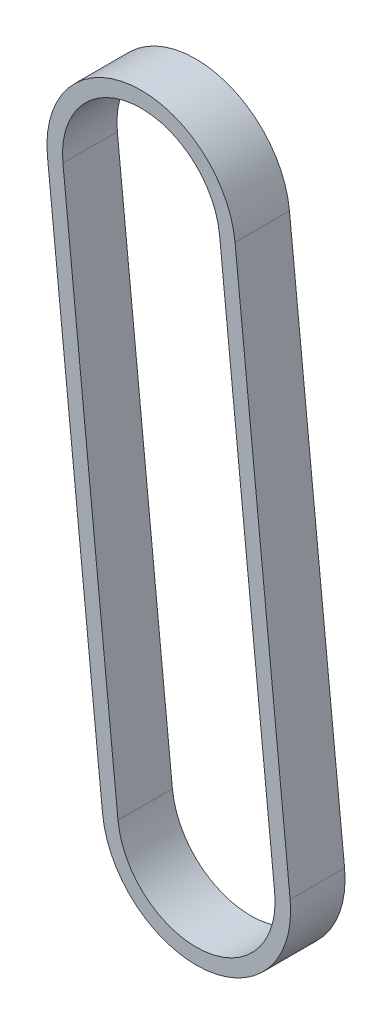
ISO-10303-21;
HEADER;
FILE_DESCRIPTION(('STEP AP214'),'2;1');
FILE_NAME('part.step','',(''),(''),'','','');
FILE_SCHEMA(('AUTOMOTIVE_DESIGN { 1 0 10303 214 1 1 1 1 }'));
ENDSEC;
DATA;
#1=APPLICATION_CONTEXT('core data for automotive mechanical design processes');
#2=APPLICATION_PROTOCOL_DEFINITION('international standard','automotive_design',2000,#1);
#3=PRODUCT_CONTEXT('',#1,'mechanical');
#4=PRODUCT('Part','Part','',(#3));
#5=PRODUCT_RELATED_PRODUCT_CATEGORY('part','',(#4));
#6=PRODUCT_DEFINITION_FORMATION('','',#4);
#7=PRODUCT_DEFINITION_CONTEXT('part definition',#1,'design');
#8=PRODUCT_DEFINITION('design','',#6,#7);
#9=PRODUCT_DEFINITION_SHAPE('','',#8);
#10=(LENGTH_UNIT() NAMED_UNIT(*) SI_UNIT(.MILLI.,.METRE.));
#11=(NAMED_UNIT(*) PLANE_ANGLE_UNIT() SI_UNIT($,.RADIAN.));
#12=(NAMED_UNIT(*) SI_UNIT($,.STERADIAN.) SOLID_ANGLE_UNIT());
#13=UNCERTAINTY_MEASURE_WITH_UNIT(LENGTH_MEASURE(1.E-05),#10,'distance_accuracy_value','');
#14=(GEOMETRIC_REPRESENTATION_CONTEXT(3) GLOBAL_UNCERTAINTY_ASSIGNED_CONTEXT((#13)) GLOBAL_UNIT_ASSIGNED_CONTEXT((#10,
#11,#12)) REPRESENTATION_CONTEXT('',''));
#15=CARTESIAN_POINT('',(0.,0.,0.));
#16=DIRECTION('',(0.,0.,1.));
#17=DIRECTION('',(1.,0.,0.));
#18=AXIS2_PLACEMENT_3D('',#15,#16,#17);
#19=CARTESIAN_POINT('',(-22.666284479526,-39.1802345315065,3.5));
#20=DIRECTION('',(0.,0.,-1.));
#21=DIRECTION('',(-1.,0.,0.));
#22=AXIS2_PLACEMENT_3D('',#19,#20,#21);
#23=PLANE('',#22);
#24=CARTESIAN_POINT('',(-22.666284479526,-39.1802345315065,3.5));
#25=DIRECTION('',(0.,0.,-1.));
#26=DIRECTION('',(-1.,0.,0.));
#27=AXIS2_PLACEMENT_3D('',#24,#25,#26);
#28=CIRCLE('',#27,12.125);
#29=CARTESIAN_POINT('',(-34.7290651312273,-40.4069977315341,3.5));
#30=VERTEX_POINT('',#29);
#31=CARTESIAN_POINT('',(-10.6035038278247,-37.953471331479,3.5));
#32=VERTEX_POINT('',#31);
#33=EDGE_CURVE('E160',#30,#32,#28,.F.);
#34=ORIENTED_EDGE('',*,*,#33,.T.);
#35=DIRECTION('',(-0.101176346394023,0.994868507356805,0.));
#36=VECTOR('',#35,1.);
#37=CARTESIAN_POINT('',(-10.6035038278248,-37.953471331479,3.5));
#38=LINE('',#37,#36);
#39=CARTESIAN_POINT('',(-17.6858480754069,31.6873241835021,3.5));
#40=VERTEX_POINT('',#39);
#41=EDGE_CURVE('E163',#32,#40,#38,.T.);
#42=ORIENTED_EDGE('',*,*,#41,.T.);
#43=CARTESIAN_POINT('',(-29.7486287271081,30.4605609834746,3.5));
#44=DIRECTION('',(0.,0.,-1.));
#45=DIRECTION('',(-1.,0.,0.));
#46=AXIS2_PLACEMENT_3D('',#43,#44,#45);
#47=CIRCLE('',#46,12.125);
#48=CARTESIAN_POINT('',(-41.8114093788094,29.233797783447,3.5));
#49=VERTEX_POINT('',#48);
#50=EDGE_CURVE('E166',#40,#49,#47,.F.);
#51=ORIENTED_EDGE('',*,*,#50,.T.);
#52=DIRECTION('',(0.101176346394023,-0.994868507356805,0.));
#53=VECTOR('',#52,1.);
#54=CARTESIAN_POINT('',(-34.7290651312273,-40.4069977315341,3.5));
#55=LINE('',#54,#53);
#56=EDGE_CURVE('E168',#49,#30,#55,.T.);
#57=ORIENTED_EDGE('',*,*,#56,.T.);
#58=EDGE_LOOP('',(#34,#42,#51,#57));
#59=FACE_BOUND('',#58,.T.);
#60=CARTESIAN_POINT('',(-22.666284479526,-39.1802345315065,3.5));
#61=DIRECTION('',(0.,0.,1.));
#62=DIRECTION('',(-1.,0.,0.));
#63=AXIS2_PLACEMENT_3D('',#60,#61,#62);
#64=CIRCLE('',#63,10.125);
#65=CARTESIAN_POINT('',(-32.7393281165137,-40.204645038746,3.5));
#66=VERTEX_POINT('',#65);
#67=CARTESIAN_POINT('',(-12.5932408425384,-38.1558240242671,3.5));
#68=VERTEX_POINT('',#67);
#69=EDGE_CURVE('E124',#66,#68,#64,.T.);
#70=ORIENTED_EDGE('',*,*,#69,.F.);
#71=DIRECTION('',(0.101176346394023,-0.994868507356805,0.));
#72=VECTOR('',#71,1.);
#73=CARTESIAN_POINT('',(-32.7393281165137,-40.204645038746,3.5));
#74=LINE('',#73,#72);
#75=CARTESIAN_POINT('',(-39.8216723640958,29.4361504762351,3.5));
#76=VERTEX_POINT('',#75);
#77=EDGE_CURVE('E146',#76,#66,#74,.T.);
#78=ORIENTED_EDGE('',*,*,#77,.F.);
#79=CARTESIAN_POINT('',(-29.7486287271081,30.4605609834746,3.5));
#80=DIRECTION('',(0.,0.,1.));
#81=DIRECTION('',(-1.,0.,0.));
#82=AXIS2_PLACEMENT_3D('',#79,#80,#81);
#83=CIRCLE('',#82,10.125);
#84=CARTESIAN_POINT('',(-19.6755850901205,31.484971490714,3.5));
#85=VERTEX_POINT('',#84);
#86=EDGE_CURVE('E144',#85,#76,#83,.T.);
#87=ORIENTED_EDGE('',*,*,#86,.F.);
#88=DIRECTION('',(-0.101176346394023,0.994868507356805,0.));
#89=VECTOR('',#88,1.);
#90=CARTESIAN_POINT('',(-19.6755850901205,31.484971490714,3.5));
#91=LINE('',#90,#89);
#92=EDGE_CURVE('E132',#68,#85,#91,.T.);
#93=ORIENTED_EDGE('',*,*,#92,.F.);
#94=EDGE_LOOP('',(#70,#78,#87,#93));
#95=FACE_BOUND('',#94,.T.);
#96=ADVANCED_FACE('F59',(#59,#95),#23,.F.);
#97=CARTESIAN_POINT('',(-22.666284479526,-39.1802345315065,-3.5));
#98=DIRECTION('',(0.,0.,-1.));
#99=DIRECTION('',(-1.,0.,0.));
#100=AXIS2_PLACEMENT_3D('',#97,#98,#99);
#101=PLANE('',#100);
#102=CARTESIAN_POINT('',(-22.666284479526,-39.1802345315065,-3.5));
#103=DIRECTION('',(0.,0.,-1.));
#104=DIRECTION('',(-1.,0.,0.));
#105=AXIS2_PLACEMENT_3D('',#102,#103,#104);
#106=CIRCLE('',#105,12.125);
#107=CARTESIAN_POINT('',(-34.7290651312273,-40.4069977315341,-3.5));
#108=VERTEX_POINT('',#107);
#109=CARTESIAN_POINT('',(-10.6035038278247,-37.953471331479,-3.5));
#110=VERTEX_POINT('',#109);
#111=EDGE_CURVE('E140',#108,#110,#106,.F.);
#112=ORIENTED_EDGE('',*,*,#111,.F.);
#113=DIRECTION('',(0.101176346394023,-0.994868507356805,0.));
#114=VECTOR('',#113,1.);
#115=CARTESIAN_POINT('',(-34.7290651312273,-40.4069977315341,-3.5));
#116=LINE('',#115,#114);
#117=CARTESIAN_POINT('',(-41.8114093788094,29.233797783447,-3.5));
#118=VERTEX_POINT('',#117);
#119=EDGE_CURVE('E164',#118,#108,#116,.T.);
#120=ORIENTED_EDGE('',*,*,#119,.F.);
#121=CARTESIAN_POINT('',(-29.7486287271081,30.4605609834746,-3.5));
#122=DIRECTION('',(0.,0.,-1.));
#123=DIRECTION('',(-1.,0.,0.));
#124=AXIS2_PLACEMENT_3D('',#121,#122,#123);
#125=CIRCLE('',#124,12.125);
#126=CARTESIAN_POINT('',(-17.6858480754069,31.6873241835021,-3.5));
#127=VERTEX_POINT('',#126);
#128=EDGE_CURVE('E175',#127,#118,#125,.F.);
#129=ORIENTED_EDGE('',*,*,#128,.F.);
#130=DIRECTION('',(-0.101176346394023,0.994868507356805,0.));
#131=VECTOR('',#130,1.);
#132=CARTESIAN_POINT('',(-10.6035038278248,-37.953471331479,-3.5));
#133=LINE('',#132,#131);
#134=EDGE_CURVE('E173',#110,#127,#133,.T.);
#135=ORIENTED_EDGE('',*,*,#134,.F.);
#136=EDGE_LOOP('',(#112,#120,#129,#135));
#137=FACE_BOUND('',#136,.T.);
#138=DIRECTION('',(0.101176346394023,-0.994868507356805,0.));
#139=VECTOR('',#138,1.);
#140=CARTESIAN_POINT('',(-32.7393281165137,-40.204645038746,-3.5));
#141=LINE('',#140,#139);
#142=CARTESIAN_POINT('',(-39.8216723640958,29.4361504762351,-3.5));
#143=VERTEX_POINT('',#142);
#144=CARTESIAN_POINT('',(-32.7393281165137,-40.204645038746,-3.5));
#145=VERTEX_POINT('',#144);
#146=EDGE_CURVE('E133',#143,#145,#141,.T.);
#147=ORIENTED_EDGE('',*,*,#146,.T.);
#148=CARTESIAN_POINT('',(-22.666284479526,-39.1802345315065,-3.5));
#149=DIRECTION('',(0.,0.,1.));
#150=DIRECTION('',(-1.,0.,0.));
#151=AXIS2_PLACEMENT_3D('',#148,#149,#150);
#152=CIRCLE('',#151,10.125);
#153=CARTESIAN_POINT('',(-12.5932408425384,-38.1558240242671,-3.5));
#154=VERTEX_POINT('',#153);
#155=EDGE_CURVE('E82',#145,#154,#152,.T.);
#156=ORIENTED_EDGE('',*,*,#155,.T.);
#157=DIRECTION('',(-0.101176346394023,0.994868507356805,0.));
#158=VECTOR('',#157,1.);
#159=CARTESIAN_POINT('',(-19.6755850901205,31.484971490714,-3.5));
#160=LINE('',#159,#158);
#161=CARTESIAN_POINT('',(-19.6755850901205,31.484971490714,-3.5));
#162=VERTEX_POINT('',#161);
#163=EDGE_CURVE('E139',#154,#162,#160,.T.);
#164=ORIENTED_EDGE('',*,*,#163,.T.);
#165=CARTESIAN_POINT('',(-29.7486287271081,30.4605609834746,-3.5));
#166=DIRECTION('',(0.,0.,1.));
#167=DIRECTION('',(-1.,0.,0.));
#168=AXIS2_PLACEMENT_3D('',#165,#166,#167);
#169=CIRCLE('',#168,10.125);
#170=EDGE_CURVE('E152',#162,#143,#169,.T.);
#171=ORIENTED_EDGE('',*,*,#170,.T.);
#172=EDGE_LOOP('',(#147,#156,#164,#171));
#173=FACE_BOUND('',#172,.T.);
#174=ADVANCED_FACE('F193',(#137,#173),#101,.T.);
#175=CARTESIAN_POINT('',(-22.666284479526,-39.1802345315065,3.5));
#176=DIRECTION('',(0.,0.,-1.));
#177=DIRECTION('',(-1.,0.,0.));
#178=AXIS2_PLACEMENT_3D('',#175,#176,#177);
#179=CYLINDRICAL_SURFACE('',#178,12.125);
#180=ORIENTED_EDGE('',*,*,#111,.T.);
#181=DIRECTION('',(0.,0.,-1.));
#182=VECTOR('',#181,1.);
#183=CARTESIAN_POINT('',(-10.6035038278247,-37.953471331479,3.5));
#184=LINE('',#183,#182);
#185=EDGE_CURVE('E12',#32,#110,#184,.T.);
#186=ORIENTED_EDGE('',*,*,#185,.F.);
#187=ORIENTED_EDGE('',*,*,#33,.F.);
#188=DIRECTION('',(0.,0.,-1.));
#189=VECTOR('',#188,1.);
#190=CARTESIAN_POINT('',(-34.7290651312273,-40.4069977315341,3.5));
#191=LINE('',#190,#189);
#192=EDGE_CURVE('E170',#30,#108,#191,.T.);
#193=ORIENTED_EDGE('',*,*,#192,.T.);
#194=EDGE_LOOP('',(#180,#186,#187,#193));
#195=FACE_BOUND('',#194,.T.);
#196=ADVANCED_FACE('F61',(#195),#179,.T.);
#197=CARTESIAN_POINT('',(-10.6035038278248,-37.953471331479,3.5));
#198=DIRECTION('',(-0.994868507356805,-0.101176346394023,0.));
#199=DIRECTION('',(0.101176346394023,-0.994868507356805,0.));
#200=AXIS2_PLACEMENT_3D('',#197,#198,#199);
#201=PLANE('',#200);
#202=ORIENTED_EDGE('',*,*,#134,.T.);
#203=DIRECTION('',(0.,0.,-1.));
#204=VECTOR('',#203,1.);
#205=CARTESIAN_POINT('',(-17.6858480754069,31.6873241835021,3.5));
#206=LINE('',#205,#204);
#207=EDGE_CURVE('E67',#40,#127,#206,.T.);
#208=ORIENTED_EDGE('',*,*,#207,.F.);
#209=ORIENTED_EDGE('',*,*,#41,.F.);
#210=ORIENTED_EDGE('',*,*,#185,.T.);
#211=EDGE_LOOP('',(#202,#208,#209,#210));
#212=FACE_BOUND('',#211,.T.);
#213=ADVANCED_FACE('F203',(#212),#201,.F.);
#214=CARTESIAN_POINT('',(-29.7486287271081,30.4605609834746,3.5));
#215=DIRECTION('',(0.,0.,-1.));
#216=DIRECTION('',(-1.,0.,0.));
#217=AXIS2_PLACEMENT_3D('',#214,#215,#216);
#218=CYLINDRICAL_SURFACE('',#217,12.125);
#219=ORIENTED_EDGE('',*,*,#128,.T.);
#220=DIRECTION('',(0.,0.,-1.));
#221=VECTOR('',#220,1.);
#222=CARTESIAN_POINT('',(-41.8114093788094,29.233797783447,3.5));
#223=LINE('',#222,#221);
#224=EDGE_CURVE('E180',#49,#118,#223,.T.);
#225=ORIENTED_EDGE('',*,*,#224,.F.);
#226=ORIENTED_EDGE('',*,*,#50,.F.);
#227=ORIENTED_EDGE('',*,*,#207,.T.);
#228=EDGE_LOOP('',(#219,#225,#226,#227));
#229=FACE_BOUND('',#228,.T.);
#230=ADVANCED_FACE('F187',(#229),#218,.T.);
#231=CARTESIAN_POINT('',(-34.7290651312273,-40.4069977315341,3.5));
#232=DIRECTION('',(0.994868507356805,0.101176346394023,0.));
#233=DIRECTION('',(-0.101176346394023,0.994868507356805,0.));
#234=AXIS2_PLACEMENT_3D('',#231,#232,#233);
#235=PLANE('',#234);
#236=ORIENTED_EDGE('',*,*,#119,.T.);
#237=ORIENTED_EDGE('',*,*,#192,.F.);
#238=ORIENTED_EDGE('',*,*,#56,.F.);
#239=ORIENTED_EDGE('',*,*,#224,.T.);
#240=EDGE_LOOP('',(#236,#237,#238,#239));
#241=FACE_BOUND('',#240,.T.);
#242=ADVANCED_FACE('F197',(#241),#235,.F.);
#243=CARTESIAN_POINT('',(-22.666284479526,-39.1802345315065,3.5));
#244=DIRECTION('',(0.,0.,-1.));
#245=DIRECTION('',(-1.,0.,0.));
#246=AXIS2_PLACEMENT_3D('',#243,#244,#245);
#247=CYLINDRICAL_SURFACE('',#246,10.125);
#248=ORIENTED_EDGE('',*,*,#155,.F.);
#249=DIRECTION('',(0.,0.,-1.));
#250=VECTOR('',#249,1.);
#251=CARTESIAN_POINT('',(-32.7393281165137,-40.204645038746,3.5));
#252=LINE('',#251,#250);
#253=EDGE_CURVE('E128',#66,#145,#252,.T.);
#254=ORIENTED_EDGE('',*,*,#253,.F.);
#255=ORIENTED_EDGE('',*,*,#69,.T.);
#256=DIRECTION('',(0.,0.,-1.));
#257=VECTOR('',#256,1.);
#258=CARTESIAN_POINT('',(-12.5932408425384,-38.1558240242671,3.5));
#259=LINE('',#258,#257);
#260=EDGE_CURVE('E127',#68,#154,#259,.T.);
#261=ORIENTED_EDGE('',*,*,#260,.T.);
#262=EDGE_LOOP('',(#248,#254,#255,#261));
#263=FACE_BOUND('',#262,.T.);
#264=ADVANCED_FACE('F126',(#263),#247,.F.);
#265=CARTESIAN_POINT('',(-19.6755850901205,31.484971490714,3.5));
#266=DIRECTION('',(-0.994868507356805,-0.101176346394023,0.));
#267=DIRECTION('',(0.101176346394023,-0.994868507356805,0.));
#268=AXIS2_PLACEMENT_3D('',#265,#266,#267);
#269=PLANE('',#268);
#270=ORIENTED_EDGE('',*,*,#163,.F.);
#271=ORIENTED_EDGE('',*,*,#260,.F.);
#272=ORIENTED_EDGE('',*,*,#92,.T.);
#273=DIRECTION('',(0.,0.,-1.));
#274=VECTOR('',#273,1.);
#275=CARTESIAN_POINT('',(-19.6755850901205,31.484971490714,3.5));
#276=LINE('',#275,#274);
#277=EDGE_CURVE('E141',#85,#162,#276,.T.);
#278=ORIENTED_EDGE('',*,*,#277,.T.);
#279=EDGE_LOOP('',(#270,#271,#272,#278));
#280=FACE_BOUND('',#279,.T.);
#281=ADVANCED_FACE('F136',(#280),#269,.T.);
#282=CARTESIAN_POINT('',(-29.7486287271081,30.4605609834746,3.5));
#283=DIRECTION('',(0.,0.,-1.));
#284=DIRECTION('',(-1.,0.,0.));
#285=AXIS2_PLACEMENT_3D('',#282,#283,#284);
#286=CYLINDRICAL_SURFACE('',#285,10.125);
#287=ORIENTED_EDGE('',*,*,#170,.F.);
#288=ORIENTED_EDGE('',*,*,#277,.F.);
#289=ORIENTED_EDGE('',*,*,#86,.T.);
#290=DIRECTION('',(0.,0.,-1.));
#291=VECTOR('',#290,1.);
#292=CARTESIAN_POINT('',(-39.8216723640958,29.4361504762351,3.5));
#293=LINE('',#292,#291);
#294=EDGE_CURVE('E74',#76,#143,#293,.T.);
#295=ORIENTED_EDGE('',*,*,#294,.T.);
#296=EDGE_LOOP('',(#287,#288,#289,#295));
#297=FACE_BOUND('',#296,.T.);
#298=ADVANCED_FACE('F226',(#297),#286,.F.);
#299=CARTESIAN_POINT('',(-32.7393281165137,-40.204645038746,3.5));
#300=DIRECTION('',(0.994868507356805,0.101176346394023,0.));
#301=DIRECTION('',(-0.101176346394023,0.994868507356805,0.));
#302=AXIS2_PLACEMENT_3D('',#299,#300,#301);
#303=PLANE('',#302);
#304=ORIENTED_EDGE('',*,*,#146,.F.);
#305=ORIENTED_EDGE('',*,*,#294,.F.);
#306=ORIENTED_EDGE('',*,*,#77,.T.);
#307=ORIENTED_EDGE('',*,*,#253,.T.);
#308=EDGE_LOOP('',(#304,#305,#306,#307));
#309=FACE_BOUND('',#308,.T.);
#310=ADVANCED_FACE('F230',(#309),#303,.T.);
#311=CLOSED_SHELL('',(#96,#174,#196,#213,#230,#242,#264,#281,#298,#310));
#312=MANIFOLD_SOLID_BREP('B2',#311);
#313=ADVANCED_BREP_SHAPE_REPRESENTATION('',(#18,#312),#14);
#314=SHAPE_DEFINITION_REPRESENTATION(#9,#313);
ENDSEC;
END-ISO-10303-21;
